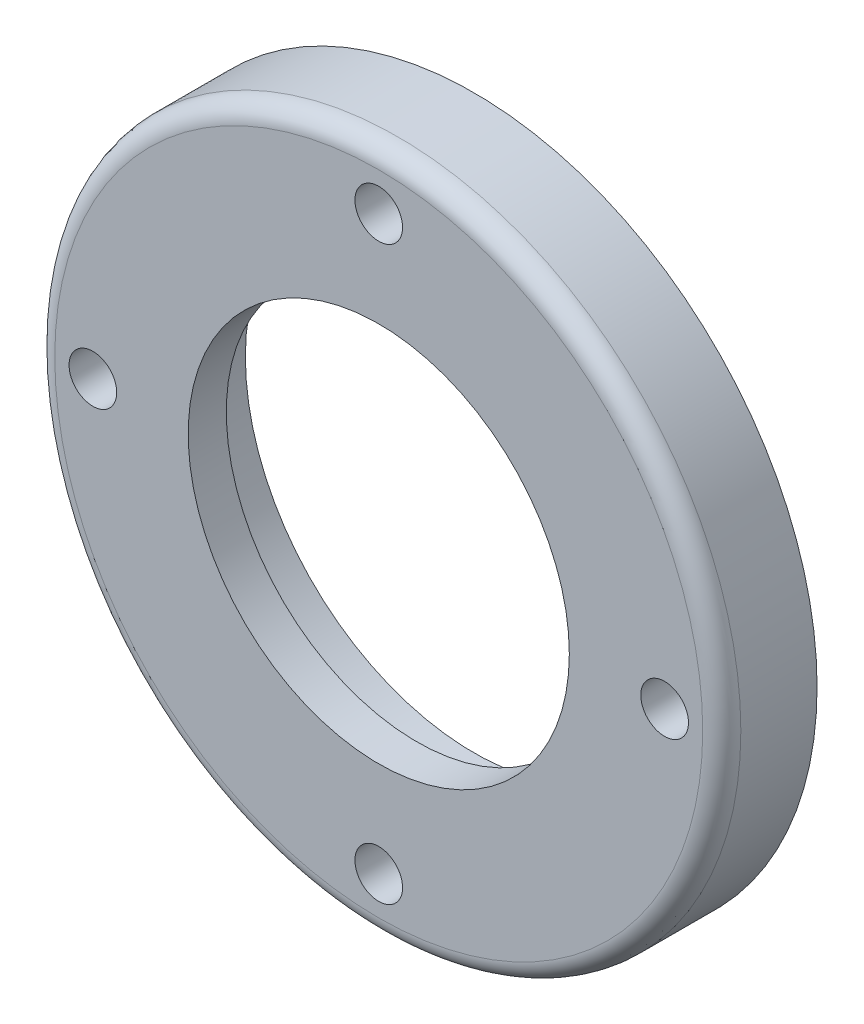
ISO-10303-21;
HEADER;
FILE_DESCRIPTION(('STEP AP214'),'2;1');
FILE_NAME('part.step','',(''),(''),'','','');
FILE_SCHEMA(('AUTOMOTIVE_DESIGN { 1 0 10303 214 1 1 1 1 }'));
ENDSEC;
DATA;
#1=APPLICATION_CONTEXT('core data for automotive mechanical design processes');
#2=APPLICATION_PROTOCOL_DEFINITION('international standard','automotive_design',2000,#1);
#3=PRODUCT_CONTEXT('',#1,'mechanical');
#4=PRODUCT('Part','Part','',(#3));
#5=PRODUCT_RELATED_PRODUCT_CATEGORY('part','',(#4));
#6=PRODUCT_DEFINITION_FORMATION('','',#4);
#7=PRODUCT_DEFINITION_CONTEXT('part definition',#1,'design');
#8=PRODUCT_DEFINITION('design','',#6,#7);
#9=PRODUCT_DEFINITION_SHAPE('','',#8);
#10=(LENGTH_UNIT() NAMED_UNIT(*) SI_UNIT(.MILLI.,.METRE.));
#11=(NAMED_UNIT(*) PLANE_ANGLE_UNIT() SI_UNIT($,.RADIAN.));
#12=(NAMED_UNIT(*) SI_UNIT($,.STERADIAN.) SOLID_ANGLE_UNIT());
#13=UNCERTAINTY_MEASURE_WITH_UNIT(LENGTH_MEASURE(1.E-05),#10,'distance_accuracy_value','');
#14=(GEOMETRIC_REPRESENTATION_CONTEXT(3) GLOBAL_UNCERTAINTY_ASSIGNED_CONTEXT((#13)) GLOBAL_UNIT_ASSIGNED_CONTEXT((#10,
#11,#12)) REPRESENTATION_CONTEXT('',''));
#15=CARTESIAN_POINT('',(0.,0.,0.));
#16=DIRECTION('',(0.,0.,1.));
#17=DIRECTION('',(1.,0.,0.));
#18=AXIS2_PLACEMENT_3D('',#15,#16,#17);
#19=CARTESIAN_POINT('',(0.,0.,5.));
#20=DIRECTION('',(0.,0.,-1.));
#21=DIRECTION('',(-1.,0.,0.));
#22=AXIS2_PLACEMENT_3D('',#19,#20,#21);
#23=CYLINDRICAL_SURFACE('',#22,12.);
#24=CARTESIAN_POINT('',(0.,0.,0.));
#25=DIRECTION('',(0.,0.,1.));
#26=DIRECTION('',(1.,0.,0.));
#27=AXIS2_PLACEMENT_3D('',#24,#25,#26);
#28=CIRCLE('',#27,12.);
#29=CARTESIAN_POINT('',(12.,0.,0.));
#30=VERTEX_POINT('',#29);
#31=EDGE_CURVE('E57',#30,#30,#28,.T.);
#32=ORIENTED_EDGE('',*,*,#31,.F.);
#33=EDGE_LOOP('',(#32));
#34=FACE_BOUND('',#33,.T.);
#35=CARTESIAN_POINT('',(0.,0.,3.));
#36=DIRECTION('',(0.,0.,1.));
#37=DIRECTION('',(1.,0.,0.));
#38=AXIS2_PLACEMENT_3D('',#35,#36,#37);
#39=CIRCLE('',#38,12.);
#40=CARTESIAN_POINT('',(12.,0.,3.));
#41=VERTEX_POINT('',#40);
#42=EDGE_CURVE('E89',#41,#41,#39,.T.);
#43=ORIENTED_EDGE('',*,*,#42,.T.);
#44=EDGE_LOOP('',(#43));
#45=FACE_BOUND('',#44,.T.);
#46=ADVANCED_FACE('F36',(#34,#45),#23,.F.);
#47=CARTESIAN_POINT('',(0.,0.,5.));
#48=DIRECTION('',(0.,0.,1.));
#49=DIRECTION('',(1.,0.,0.));
#50=AXIS2_PLACEMENT_3D('',#47,#48,#49);
#51=PLANE('',#50);
#52=CARTESIAN_POINT('',(0.,0.,5.));
#53=DIRECTION('',(0.,0.,1.));
#54=DIRECTION('',(1.,0.,0.));
#55=AXIS2_PLACEMENT_3D('',#52,#53,#54);
#56=CIRCLE('',#55,17.);
#57=CARTESIAN_POINT('',(17.,0.,5.));
#58=VERTEX_POINT('',#57);
#59=EDGE_CURVE('E44',#58,#58,#56,.T.);
#60=ORIENTED_EDGE('',*,*,#59,.T.);
#61=EDGE_LOOP('',(#60));
#62=FACE_BOUND('',#61,.T.);
#63=CARTESIAN_POINT('',(0.,-15.,5.));
#64=DIRECTION('',(0.,0.,1.));
#65=DIRECTION('',(1.,0.,0.));
#66=AXIS2_PLACEMENT_3D('',#63,#64,#65);
#67=CIRCLE('',#66,1.25);
#68=CARTESIAN_POINT('',(1.25,-15.,5.));
#69=VERTEX_POINT('',#68);
#70=EDGE_CURVE('E75',#69,#69,#67,.T.);
#71=ORIENTED_EDGE('',*,*,#70,.F.);
#72=EDGE_LOOP('',(#71));
#73=FACE_BOUND('',#72,.T.);
#74=CARTESIAN_POINT('',(0.,15.,5.));
#75=DIRECTION('',(0.,0.,1.));
#76=DIRECTION('',(1.,0.,0.));
#77=AXIS2_PLACEMENT_3D('',#74,#75,#76);
#78=CIRCLE('',#77,1.25);
#79=CARTESIAN_POINT('',(1.25,15.,5.));
#80=VERTEX_POINT('',#79);
#81=EDGE_CURVE('E63',#80,#80,#78,.T.);
#82=ORIENTED_EDGE('',*,*,#81,.F.);
#83=EDGE_LOOP('',(#82));
#84=FACE_BOUND('',#83,.T.);
#85=CARTESIAN_POINT('',(-15.,0.,5.));
#86=DIRECTION('',(0.,0.,1.));
#87=DIRECTION('',(1.,0.,0.));
#88=AXIS2_PLACEMENT_3D('',#85,#86,#87);
#89=CIRCLE('',#88,1.25);
#90=CARTESIAN_POINT('',(-13.75,0.,5.));
#91=VERTEX_POINT('',#90);
#92=EDGE_CURVE('E67',#91,#91,#89,.T.);
#93=ORIENTED_EDGE('',*,*,#92,.F.);
#94=EDGE_LOOP('',(#93));
#95=FACE_BOUND('',#94,.T.);
#96=CARTESIAN_POINT('',(15.,0.,5.));
#97=DIRECTION('',(0.,0.,1.));
#98=DIRECTION('',(1.,0.,0.));
#99=AXIS2_PLACEMENT_3D('',#96,#97,#98);
#100=CIRCLE('',#99,1.25);
#101=CARTESIAN_POINT('',(16.25,0.,5.));
#102=VERTEX_POINT('',#101);
#103=EDGE_CURVE('E82',#102,#102,#100,.T.);
#104=ORIENTED_EDGE('',*,*,#103,.F.);
#105=EDGE_LOOP('',(#104));
#106=FACE_BOUND('',#105,.T.);
#107=CARTESIAN_POINT('',(0.,0.,5.));
#108=DIRECTION('',(0.,0.,1.));
#109=DIRECTION('',(1.,0.,0.));
#110=AXIS2_PLACEMENT_3D('',#107,#108,#109);
#111=CIRCLE('',#110,10.);
#112=CARTESIAN_POINT('',(10.,0.,5.));
#113=VERTEX_POINT('',#112);
#114=EDGE_CURVE('E97',#113,#113,#111,.T.);
#115=ORIENTED_EDGE('',*,*,#114,.F.);
#116=EDGE_LOOP('',(#115));
#117=FACE_BOUND('',#116,.T.);
#118=ADVANCED_FACE('F114',(#62,#73,#84,#95,#106,#117),#51,.T.);
#119=CARTESIAN_POINT('',(0.,0.,0.));
#120=DIRECTION('',(0.,0.,1.));
#121=DIRECTION('',(1.,0.,0.));
#122=AXIS2_PLACEMENT_3D('',#119,#120,#121);
#123=PLANE('',#122);
#124=CARTESIAN_POINT('',(0.,0.,0.));
#125=DIRECTION('',(0.,0.,1.));
#126=DIRECTION('',(1.,0.,0.));
#127=AXIS2_PLACEMENT_3D('',#124,#125,#126);
#128=CIRCLE('',#127,18.);
#129=CARTESIAN_POINT('',(18.,0.,0.));
#130=VERTEX_POINT('',#129);
#131=EDGE_CURVE('E51',#130,#130,#128,.T.);
#132=ORIENTED_EDGE('',*,*,#131,.F.);
#133=EDGE_LOOP('',(#132));
#134=FACE_BOUND('',#133,.T.);
#135=ORIENTED_EDGE('',*,*,#31,.T.);
#136=EDGE_LOOP('',(#135));
#137=FACE_BOUND('',#136,.T.);
#138=CARTESIAN_POINT('',(0.,15.,0.));
#139=DIRECTION('',(0.,0.,1.));
#140=DIRECTION('',(1.,0.,0.));
#141=AXIS2_PLACEMENT_3D('',#138,#139,#140);
#142=CIRCLE('',#141,1.25);
#143=CARTESIAN_POINT('',(1.25,15.,0.));
#144=VERTEX_POINT('',#143);
#145=EDGE_CURVE('E64',#144,#144,#142,.T.);
#146=ORIENTED_EDGE('',*,*,#145,.T.);
#147=EDGE_LOOP('',(#146));
#148=FACE_BOUND('',#147,.T.);
#149=CARTESIAN_POINT('',(-15.,0.,0.));
#150=DIRECTION('',(0.,0.,1.));
#151=DIRECTION('',(1.,0.,0.));
#152=AXIS2_PLACEMENT_3D('',#149,#150,#151);
#153=CIRCLE('',#152,1.25);
#154=CARTESIAN_POINT('',(-13.75,0.,0.));
#155=VERTEX_POINT('',#154);
#156=EDGE_CURVE('E71',#155,#155,#153,.T.);
#157=ORIENTED_EDGE('',*,*,#156,.T.);
#158=EDGE_LOOP('',(#157));
#159=FACE_BOUND('',#158,.T.);
#160=CARTESIAN_POINT('',(0.,-15.,0.));
#161=DIRECTION('',(0.,0.,1.));
#162=DIRECTION('',(1.,0.,0.));
#163=AXIS2_PLACEMENT_3D('',#160,#161,#162);
#164=CIRCLE('',#163,1.25);
#165=CARTESIAN_POINT('',(1.25,-15.,0.));
#166=VERTEX_POINT('',#165);
#167=EDGE_CURVE('E79',#166,#166,#164,.T.);
#168=ORIENTED_EDGE('',*,*,#167,.T.);
#169=EDGE_LOOP('',(#168));
#170=FACE_BOUND('',#169,.T.);
#171=CARTESIAN_POINT('',(15.,0.,0.));
#172=DIRECTION('',(0.,0.,1.));
#173=DIRECTION('',(1.,0.,0.));
#174=AXIS2_PLACEMENT_3D('',#171,#172,#173);
#175=CIRCLE('',#174,1.25);
#176=CARTESIAN_POINT('',(16.25,0.,0.));
#177=VERTEX_POINT('',#176);
#178=EDGE_CURVE('E86',#177,#177,#175,.T.);
#179=ORIENTED_EDGE('',*,*,#178,.T.);
#180=EDGE_LOOP('',(#179));
#181=FACE_BOUND('',#180,.T.);
#182=ADVANCED_FACE('F116',(#134,#137,#148,#159,#170,#181),#123,.F.);
#183=CARTESIAN_POINT('',(0.,0.,5.));
#184=DIRECTION('',(0.,0.,-1.));
#185=DIRECTION('',(-1.,0.,0.));
#186=AXIS2_PLACEMENT_3D('',#183,#184,#185);
#187=CYLINDRICAL_SURFACE('',#186,18.);
#188=CARTESIAN_POINT('',(0.,0.,4.));
#189=DIRECTION('',(0.,0.,1.));
#190=DIRECTION('',(1.,0.,0.));
#191=AXIS2_PLACEMENT_3D('',#188,#189,#190);
#192=CIRCLE('',#191,18.);
#193=CARTESIAN_POINT('',(18.,0.,4.));
#194=VERTEX_POINT('',#193);
#195=EDGE_CURVE('E10',#194,#194,#192,.F.);
#196=ORIENTED_EDGE('',*,*,#195,.T.);
#197=EDGE_LOOP('',(#196));
#198=FACE_BOUND('',#197,.T.);
#199=ORIENTED_EDGE('',*,*,#131,.T.);
#200=EDGE_LOOP('',(#199));
#201=FACE_BOUND('',#200,.T.);
#202=ADVANCED_FACE('F122',(#198,#201),#187,.T.);
#203=CARTESIAN_POINT('',(0.,15.,5.));
#204=DIRECTION('',(0.,0.,-1.));
#205=DIRECTION('',(-1.,0.,0.));
#206=AXIS2_PLACEMENT_3D('',#203,#204,#205);
#207=CYLINDRICAL_SURFACE('',#206,1.25);
#208=ORIENTED_EDGE('',*,*,#81,.T.);
#209=EDGE_LOOP('',(#208));
#210=FACE_BOUND('',#209,.T.);
#211=ORIENTED_EDGE('',*,*,#145,.F.);
#212=EDGE_LOOP('',(#211));
#213=FACE_BOUND('',#212,.T.);
#214=ADVANCED_FACE('F130',(#210,#213),#207,.F.);
#215=CARTESIAN_POINT('',(-15.,0.,5.));
#216=DIRECTION('',(0.,0.,-1.));
#217=DIRECTION('',(-1.,0.,0.));
#218=AXIS2_PLACEMENT_3D('',#215,#216,#217);
#219=CYLINDRICAL_SURFACE('',#218,1.25);
#220=ORIENTED_EDGE('',*,*,#92,.T.);
#221=EDGE_LOOP('',(#220));
#222=FACE_BOUND('',#221,.T.);
#223=ORIENTED_EDGE('',*,*,#156,.F.);
#224=EDGE_LOOP('',(#223));
#225=FACE_BOUND('',#224,.T.);
#226=ADVANCED_FACE('F134',(#222,#225),#219,.F.);
#227=CARTESIAN_POINT('',(0.,-15.,5.));
#228=DIRECTION('',(0.,0.,-1.));
#229=DIRECTION('',(-1.,0.,0.));
#230=AXIS2_PLACEMENT_3D('',#227,#228,#229);
#231=CYLINDRICAL_SURFACE('',#230,1.25);
#232=ORIENTED_EDGE('',*,*,#70,.T.);
#233=EDGE_LOOP('',(#232));
#234=FACE_BOUND('',#233,.T.);
#235=ORIENTED_EDGE('',*,*,#167,.F.);
#236=EDGE_LOOP('',(#235));
#237=FACE_BOUND('',#236,.T.);
#238=ADVANCED_FACE('F151',(#234,#237),#231,.F.);
#239=CARTESIAN_POINT('',(15.,0.,5.));
#240=DIRECTION('',(0.,0.,-1.));
#241=DIRECTION('',(-1.,0.,0.));
#242=AXIS2_PLACEMENT_3D('',#239,#240,#241);
#243=CYLINDRICAL_SURFACE('',#242,1.25);
#244=ORIENTED_EDGE('',*,*,#103,.T.);
#245=EDGE_LOOP('',(#244));
#246=FACE_BOUND('',#245,.T.);
#247=ORIENTED_EDGE('',*,*,#178,.F.);
#248=EDGE_LOOP('',(#247));
#249=FACE_BOUND('',#248,.T.);
#250=ADVANCED_FACE('F149',(#246,#249),#243,.F.);
#251=CARTESIAN_POINT('',(0.,0.,3.));
#252=DIRECTION('',(0.,0.,1.));
#253=DIRECTION('',(1.,0.,0.));
#254=AXIS2_PLACEMENT_3D('',#251,#252,#253);
#255=PLANE('',#254);
#256=CARTESIAN_POINT('',(0.,0.,3.));
#257=DIRECTION('',(0.,0.,1.));
#258=DIRECTION('',(1.,0.,0.));
#259=AXIS2_PLACEMENT_3D('',#256,#257,#258);
#260=CIRCLE('',#259,10.);
#261=CARTESIAN_POINT('',(10.,0.,3.));
#262=VERTEX_POINT('',#261);
#263=EDGE_CURVE('E96',#262,#262,#260,.T.);
#264=ORIENTED_EDGE('',*,*,#263,.T.);
#265=EDGE_LOOP('',(#264));
#266=FACE_BOUND('',#265,.T.);
#267=ORIENTED_EDGE('',*,*,#42,.F.);
#268=EDGE_LOOP('',(#267));
#269=FACE_BOUND('',#268,.T.);
#270=ADVANCED_FACE('F105',(#266,#269),#255,.F.);
#271=CARTESIAN_POINT('',(0.,0.,3.));
#272=DIRECTION('',(0.,0.,1.));
#273=DIRECTION('',(1.,0.,0.));
#274=AXIS2_PLACEMENT_3D('',#271,#272,#273);
#275=CYLINDRICAL_SURFACE('',#274,10.);
#276=ORIENTED_EDGE('',*,*,#263,.F.);
#277=EDGE_LOOP('',(#276));
#278=FACE_BOUND('',#277,.T.);
#279=ORIENTED_EDGE('',*,*,#114,.T.);
#280=EDGE_LOOP('',(#279));
#281=FACE_BOUND('',#280,.T.);
#282=ADVANCED_FACE('F108',(#278,#281),#275,.F.);
#283=CARTESIAN_POINT('',(0.,0.,4.));
#284=DIRECTION('',(0.,0.,1.));
#285=DIRECTION('',(1.,0.,0.));
#286=AXIS2_PLACEMENT_3D('',#283,#284,#285);
#287=TOROIDAL_SURFACE('',#286,17.,1.);
#288=ORIENTED_EDGE('',*,*,#195,.F.);
#289=EDGE_LOOP('',(#288));
#290=FACE_BOUND('',#289,.T.);
#291=ORIENTED_EDGE('',*,*,#59,.F.);
#292=EDGE_LOOP('',(#291));
#293=FACE_BOUND('',#292,.T.);
#294=ADVANCED_FACE('F38',(#290,#293),#287,.T.);
#295=CLOSED_SHELL('',(#46,#118,#182,#202,#214,#226,#238,#250,#270,#282,#294));
#296=MANIFOLD_SOLID_BREP('B2',#295);
#297=ADVANCED_BREP_SHAPE_REPRESENTATION('',(#18,#296),#14);
#298=SHAPE_DEFINITION_REPRESENTATION(#9,#297);
ENDSEC;
END-ISO-10303-21;
